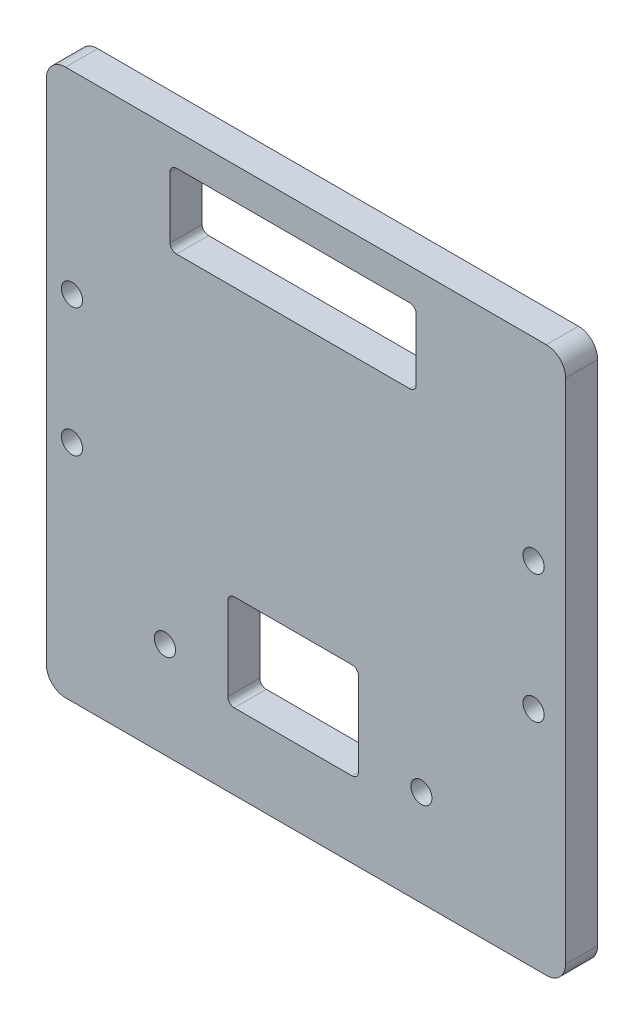
ISO-10303-21;
HEADER;
FILE_DESCRIPTION(('STEP AP214'),'2;1');
FILE_NAME('part.step','',(''),(''),'','','');
FILE_SCHEMA(('AUTOMOTIVE_DESIGN { 1 0 10303 214 1 1 1 1 }'));
ENDSEC;
DATA;
#1=APPLICATION_CONTEXT('core data for automotive mechanical design processes');
#2=APPLICATION_PROTOCOL_DEFINITION('international standard','automotive_design',2000,#1);
#3=PRODUCT_CONTEXT('',#1,'mechanical');
#4=PRODUCT('Part','Part','',(#3));
#5=PRODUCT_RELATED_PRODUCT_CATEGORY('part','',(#4));
#6=PRODUCT_DEFINITION_FORMATION('','',#4);
#7=PRODUCT_DEFINITION_CONTEXT('part definition',#1,'design');
#8=PRODUCT_DEFINITION('design','',#6,#7);
#9=PRODUCT_DEFINITION_SHAPE('','',#8);
#10=(LENGTH_UNIT() NAMED_UNIT(*) SI_UNIT(.MILLI.,.METRE.));
#11=(NAMED_UNIT(*) PLANE_ANGLE_UNIT() SI_UNIT($,.RADIAN.));
#12=(NAMED_UNIT(*) SI_UNIT($,.STERADIAN.) SOLID_ANGLE_UNIT());
#13=UNCERTAINTY_MEASURE_WITH_UNIT(LENGTH_MEASURE(1.E-05),#10,'distance_accuracy_value','');
#14=(GEOMETRIC_REPRESENTATION_CONTEXT(3) GLOBAL_UNCERTAINTY_ASSIGNED_CONTEXT((#13)) GLOBAL_UNIT_ASSIGNED_CONTEXT((#10,
#11,#12)) REPRESENTATION_CONTEXT('',''));
#15=CARTESIAN_POINT('',(0.,0.,0.));
#16=DIRECTION('',(0.,0.,1.));
#17=DIRECTION('',(1.,0.,0.));
#18=AXIS2_PLACEMENT_3D('',#15,#16,#17);
#19=CARTESIAN_POINT('',(0.,0.,43.4989056307904));
#20=DIRECTION('',(0.,0.,1.));
#21=DIRECTION('',(1.,0.,0.));
#22=AXIS2_PLACEMENT_3D('',#19,#20,#21);
#23=PLANE('',#22);
#24=CARTESIAN_POINT('',(16.7989221606857,40.7225688335815,43.4989056307904));
#25=DIRECTION('',(0.,0.,1.));
#26=DIRECTION('',(1.,0.,0.));
#27=AXIS2_PLACEMENT_3D('',#24,#25,#26);
#28=CIRCLE('',#27,1.65);
#29=CARTESIAN_POINT('',(18.4489221606857,40.7225688335815,43.4989056307904));
#30=VERTEX_POINT('',#29);
#31=EDGE_CURVE('E833',#30,#30,#28,.T.);
#32=ORIENTED_EDGE('',*,*,#31,.F.);
#33=EDGE_LOOP('',(#32));
#34=FACE_BOUND('',#33,.T.);
#35=CARTESIAN_POINT('',(-40.7010778393143,20.7225688335815,43.4989056307904));
#36=DIRECTION('',(0.,0.,1.));
#37=DIRECTION('',(1.,0.,0.));
#38=AXIS2_PLACEMENT_3D('',#35,#36,#37);
#39=CIRCLE('',#38,1.65);
#40=CARTESIAN_POINT('',(-39.0510778393143,20.7225688335815,43.4989056307904));
#41=VERTEX_POINT('',#40);
#42=EDGE_CURVE('E817',#41,#41,#39,.T.);
#43=ORIENTED_EDGE('',*,*,#42,.F.);
#44=EDGE_LOOP('',(#43));
#45=FACE_BOUND('',#44,.T.);
#46=CARTESIAN_POINT('',(-55.2010778393143,60.7225688335815,43.4989056307904));
#47=DIRECTION('',(0.,0.,1.));
#48=DIRECTION('',(1.,0.,0.));
#49=AXIS2_PLACEMENT_3D('',#46,#47,#48);
#50=CIRCLE('',#49,1.65);
#51=CARTESIAN_POINT('',(-53.5510778393143,60.7225688335815,43.4989056307904));
#52=VERTEX_POINT('',#51);
#53=EDGE_CURVE('E427',#52,#52,#50,.T.);
#54=ORIENTED_EDGE('',*,*,#53,.F.);
#55=EDGE_LOOP('',(#54));
#56=FACE_BOUND('',#55,.T.);
#57=DIRECTION('',(-1.,0.,0.));
#58=VECTOR('',#57,1.);
#59=CARTESIAN_POINT('',(-59.2010778393143,90.9225688335816,43.4989056307904));
#60=LINE('',#59,#58);
#61=CARTESIAN_POINT('',(18.7989221606857,90.9225688335816,43.4989056307904));
#62=VERTEX_POINT('',#61);
#63=CARTESIAN_POINT('',(-56.2010778393143,90.9225688335816,43.4989056307904));
#64=VERTEX_POINT('',#63);
#65=EDGE_CURVE('E245',#62,#64,#60,.T.);
#66=ORIENTED_EDGE('',*,*,#65,.T.);
#67=CARTESIAN_POINT('',(-56.2010778393143,87.9225688335816,43.4989056307904));
#68=DIRECTION('',(0.,0.,1.));
#69=DIRECTION('',(1.,0.,0.));
#70=AXIS2_PLACEMENT_3D('',#67,#68,#69);
#71=CIRCLE('',#70,3.);
#72=CARTESIAN_POINT('',(-59.2010778393143,87.9225688335816,43.4989056307904));
#73=VERTEX_POINT('',#72);
#74=EDGE_CURVE('E277',#64,#73,#71,.T.);
#75=ORIENTED_EDGE('',*,*,#74,.T.);
#76=DIRECTION('',(0.,-1.,0.));
#77=VECTOR('',#76,1.);
#78=CARTESIAN_POINT('',(-59.2010778393143,90.9225688335816,43.4989056307904));
#79=LINE('',#78,#77);
#80=CARTESIAN_POINT('',(-59.2010778393143,8.72256883358154,43.4989056307904));
#81=VERTEX_POINT('',#80);
#82=EDGE_CURVE('E224',#73,#81,#79,.T.);
#83=ORIENTED_EDGE('',*,*,#82,.T.);
#84=CARTESIAN_POINT('',(-56.2010778393143,8.72256883358153,43.4989056307904));
#85=DIRECTION('',(0.,0.,1.));
#86=DIRECTION('',(1.,0.,0.));
#87=AXIS2_PLACEMENT_3D('',#84,#85,#86);
#88=CIRCLE('',#87,3.);
#89=CARTESIAN_POINT('',(-56.2010778393143,5.72256883358153,43.4989056307904));
#90=VERTEX_POINT('',#89);
#91=EDGE_CURVE('E274',#81,#90,#88,.T.);
#92=ORIENTED_EDGE('',*,*,#91,.T.);
#93=DIRECTION('',(1.,0.,0.));
#94=VECTOR('',#93,1.);
#95=CARTESIAN_POINT('',(-59.2010778393143,5.72256883358153,43.4989056307904));
#96=LINE('',#95,#94);
#97=CARTESIAN_POINT('',(18.7989221606857,5.72256883358153,43.4989056307904));
#98=VERTEX_POINT('',#97);
#99=EDGE_CURVE('E461',#90,#98,#96,.T.);
#100=ORIENTED_EDGE('',*,*,#99,.T.);
#101=CARTESIAN_POINT('',(18.7989221606857,8.72256883358152,43.4989056307904));
#102=DIRECTION('',(0.,0.,1.));
#103=DIRECTION('',(1.,0.,0.));
#104=AXIS2_PLACEMENT_3D('',#101,#102,#103);
#105=CIRCLE('',#104,3.);
#106=CARTESIAN_POINT('',(21.7989221606857,8.72256883358152,43.4989056307904));
#107=VERTEX_POINT('',#106);
#108=EDGE_CURVE('E271',#98,#107,#105,.T.);
#109=ORIENTED_EDGE('',*,*,#108,.T.);
#110=DIRECTION('',(0.,1.,0.));
#111=VECTOR('',#110,1.);
#112=CARTESIAN_POINT('',(21.7989221606857,90.9225688335816,43.4989056307904));
#113=LINE('',#112,#111);
#114=CARTESIAN_POINT('',(21.7989221606857,87.9225688335816,43.4989056307904));
#115=VERTEX_POINT('',#114);
#116=EDGE_CURVE('E464',#107,#115,#113,.T.);
#117=ORIENTED_EDGE('',*,*,#116,.T.);
#118=CARTESIAN_POINT('',(18.7989221606857,87.9225688335816,43.4989056307904));
#119=DIRECTION('',(0.,0.,1.));
#120=DIRECTION('',(1.,0.,0.));
#121=AXIS2_PLACEMENT_3D('',#118,#119,#120);
#122=CIRCLE('',#121,3.);
#123=EDGE_CURVE('E268',#115,#62,#122,.T.);
#124=ORIENTED_EDGE('',*,*,#123,.T.);
#125=EDGE_LOOP('',(#66,#75,#83,#92,#100,#109,#117,#124));
#126=FACE_BOUND('',#125,.T.);
#127=DIRECTION('',(1.,0.,0.));
#128=VECTOR('',#127,1.);
#129=CARTESIAN_POINT('',(-30.9010778393143,17.5225688335815,43.4989056307904));
#130=LINE('',#129,#128);
#131=CARTESIAN_POINT('',(-29.9010778393143,17.5225688335815,43.4989056307904));
#132=VERTEX_POINT('',#131);
#133=CARTESIAN_POINT('',(-11.5010778393143,17.5225688335815,43.4989056307904));
#134=VERTEX_POINT('',#133);
#135=EDGE_CURVE('E437',#132,#134,#130,.T.);
#136=ORIENTED_EDGE('',*,*,#135,.F.);
#137=CARTESIAN_POINT('',(-29.9010778393143,18.5225688335815,43.4989056307904));
#138=DIRECTION('',(0.,0.,1.));
#139=DIRECTION('',(1.,0.,0.));
#140=AXIS2_PLACEMENT_3D('',#137,#138,#139);
#141=CIRCLE('',#140,1.);
#142=CARTESIAN_POINT('',(-30.9010778393143,18.5225688335815,43.4989056307904));
#143=VERTEX_POINT('',#142);
#144=EDGE_CURVE('E352',#132,#143,#141,.F.);
#145=ORIENTED_EDGE('',*,*,#144,.T.);
#146=DIRECTION('',(0.,-1.,0.));
#147=VECTOR('',#146,1.);
#148=CARTESIAN_POINT('',(-30.9010778393143,32.5225688335815,43.4989056307904));
#149=LINE('',#148,#147);
#150=CARTESIAN_POINT('',(-30.9010778393143,31.5225688335815,43.4989056307904));
#151=VERTEX_POINT('',#150);
#152=EDGE_CURVE('E433',#151,#143,#149,.T.);
#153=ORIENTED_EDGE('',*,*,#152,.F.);
#154=CARTESIAN_POINT('',(-29.9010778393143,31.5225688335815,43.4989056307904));
#155=DIRECTION('',(0.,0.,1.));
#156=DIRECTION('',(1.,0.,0.));
#157=AXIS2_PLACEMENT_3D('',#154,#155,#156);
#158=CIRCLE('',#157,1.);
#159=CARTESIAN_POINT('',(-29.9010778393143,32.5225688335815,43.4989056307904));
#160=VERTEX_POINT('',#159);
#161=EDGE_CURVE('E370',#151,#160,#158,.F.);
#162=ORIENTED_EDGE('',*,*,#161,.T.);
#163=DIRECTION('',(-1.,0.,0.));
#164=VECTOR('',#163,1.);
#165=CARTESIAN_POINT('',(-30.9010778393143,32.5225688335815,43.4989056307904));
#166=LINE('',#165,#164);
#167=CARTESIAN_POINT('',(-11.5010778393143,32.5225688335815,43.4989056307904));
#168=VERTEX_POINT('',#167);
#169=EDGE_CURVE('E234',#168,#160,#166,.T.);
#170=ORIENTED_EDGE('',*,*,#169,.F.);
#171=CARTESIAN_POINT('',(-11.5010778393143,31.5225688335815,43.4989056307904));
#172=DIRECTION('',(0.,0.,1.));
#173=DIRECTION('',(1.,0.,0.));
#174=AXIS2_PLACEMENT_3D('',#171,#172,#173);
#175=CIRCLE('',#174,1.);
#176=CARTESIAN_POINT('',(-10.5010778393143,31.5225688335815,43.4989056307904));
#177=VERTEX_POINT('',#176);
#178=EDGE_CURVE('E364',#168,#177,#175,.F.);
#179=ORIENTED_EDGE('',*,*,#178,.T.);
#180=DIRECTION('',(0.,1.,0.));
#181=VECTOR('',#180,1.);
#182=CARTESIAN_POINT('',(-10.5010778393143,32.5225688335815,43.4989056307904));
#183=LINE('',#182,#181);
#184=CARTESIAN_POINT('',(-10.5010778393143,18.5225688335815,43.4989056307904));
#185=VERTEX_POINT('',#184);
#186=EDGE_CURVE('E242',#185,#177,#183,.T.);
#187=ORIENTED_EDGE('',*,*,#186,.F.);
#188=CARTESIAN_POINT('',(-11.5010778393143,18.5225688335815,43.4989056307904));
#189=DIRECTION('',(0.,0.,1.));
#190=DIRECTION('',(1.,0.,0.));
#191=AXIS2_PLACEMENT_3D('',#188,#189,#190);
#192=CIRCLE('',#191,1.);
#193=EDGE_CURVE('E358',#185,#134,#192,.F.);
#194=ORIENTED_EDGE('',*,*,#193,.T.);
#195=EDGE_LOOP('',(#136,#145,#153,#162,#170,#179,#187,#194));
#196=FACE_BOUND('',#195,.T.);
#197=DIRECTION('',(1.,0.,0.));
#198=VECTOR('',#197,1.);
#199=CARTESIAN_POINT('',(-39.9010778393143,74.3225688335816,43.4989056307904));
#200=LINE('',#199,#198);
#201=CARTESIAN_POINT('',(-38.9010778393143,74.3225688335816,43.4989056307904));
#202=VERTEX_POINT('',#201);
#203=CARTESIAN_POINT('',(-2.5010778393143,74.3225688335816,43.4989056307904));
#204=VERTEX_POINT('',#203);
#205=EDGE_CURVE('E412',#202,#204,#200,.T.);
#206=ORIENTED_EDGE('',*,*,#205,.F.);
#207=CARTESIAN_POINT('',(-38.9010778393143,75.3225688335816,43.4989056307904));
#208=DIRECTION('',(0.,0.,1.));
#209=DIRECTION('',(1.,0.,0.));
#210=AXIS2_PLACEMENT_3D('',#207,#208,#209);
#211=CIRCLE('',#210,1.);
#212=CARTESIAN_POINT('',(-39.9010778393143,75.3225688335816,43.4989056307904));
#213=VERTEX_POINT('',#212);
#214=EDGE_CURVE('E382',#202,#213,#211,.F.);
#215=ORIENTED_EDGE('',*,*,#214,.T.);
#216=DIRECTION('',(0.,-1.,0.));
#217=VECTOR('',#216,1.);
#218=CARTESIAN_POINT('',(-39.9010778393143,85.9225688335816,43.4989056307904));
#219=LINE('',#218,#217);
#220=CARTESIAN_POINT('',(-39.9010778393143,84.9225688335816,43.4989056307904));
#221=VERTEX_POINT('',#220);
#222=EDGE_CURVE('E405',#221,#213,#219,.T.);
#223=ORIENTED_EDGE('',*,*,#222,.F.);
#224=CARTESIAN_POINT('',(-38.9010778393143,84.9225688335816,43.4989056307904));
#225=DIRECTION('',(0.,0.,1.));
#226=DIRECTION('',(1.,0.,0.));
#227=AXIS2_PLACEMENT_3D('',#224,#225,#226);
#228=CIRCLE('',#227,1.);
#229=CARTESIAN_POINT('',(-38.9010778393143,85.9225688335816,43.4989056307904));
#230=VERTEX_POINT('',#229);
#231=EDGE_CURVE('E376',#221,#230,#228,.F.);
#232=ORIENTED_EDGE('',*,*,#231,.T.);
#233=DIRECTION('',(-1.,0.,0.));
#234=VECTOR('',#233,1.);
#235=CARTESIAN_POINT('',(-39.9010778393143,85.9225688335816,43.4989056307904));
#236=LINE('',#235,#234);
#237=CARTESIAN_POINT('',(-2.50107783931431,85.9225688335816,43.4989056307904));
#238=VERTEX_POINT('',#237);
#239=EDGE_CURVE('E411',#238,#230,#236,.T.);
#240=ORIENTED_EDGE('',*,*,#239,.F.);
#241=CARTESIAN_POINT('',(-2.50107783931431,84.9225688335816,43.4989056307904));
#242=DIRECTION('',(0.,0.,1.));
#243=DIRECTION('',(1.,0.,0.));
#244=AXIS2_PLACEMENT_3D('',#241,#242,#243);
#245=CIRCLE('',#244,1.);
#246=CARTESIAN_POINT('',(-1.50107783931431,84.9225688335816,43.4989056307904));
#247=VERTEX_POINT('',#246);
#248=EDGE_CURVE('E11',#238,#247,#245,.F.);
#249=ORIENTED_EDGE('',*,*,#248,.T.);
#250=DIRECTION('',(0.,1.,0.));
#251=VECTOR('',#250,1.);
#252=CARTESIAN_POINT('',(-1.50107783931431,85.9225688335816,43.4989056307904));
#253=LINE('',#252,#251);
#254=CARTESIAN_POINT('',(-1.5010778393143,75.3225688335816,43.4989056307904));
#255=VERTEX_POINT('',#254);
#256=EDGE_CURVE('E408',#255,#247,#253,.T.);
#257=ORIENTED_EDGE('',*,*,#256,.F.);
#258=CARTESIAN_POINT('',(-2.5010778393143,75.3225688335816,43.4989056307904));
#259=DIRECTION('',(0.,0.,1.));
#260=DIRECTION('',(1.,0.,0.));
#261=AXIS2_PLACEMENT_3D('',#258,#259,#260);
#262=CIRCLE('',#261,1.);
#263=EDGE_CURVE('E388',#255,#204,#262,.F.);
#264=ORIENTED_EDGE('',*,*,#263,.T.);
#265=EDGE_LOOP('',(#206,#215,#223,#232,#240,#249,#257,#264));
#266=FACE_BOUND('',#265,.T.);
#267=CARTESIAN_POINT('',(-55.2010778393143,40.7225688335815,43.4989056307904));
#268=DIRECTION('',(0.,0.,1.));
#269=DIRECTION('',(1.,0.,0.));
#270=AXIS2_PLACEMENT_3D('',#267,#268,#269);
#271=CIRCLE('',#270,1.65);
#272=CARTESIAN_POINT('',(-53.5510778393143,40.7225688335815,43.4989056307904));
#273=VERTEX_POINT('',#272);
#274=EDGE_CURVE('E809',#273,#273,#271,.T.);
#275=ORIENTED_EDGE('',*,*,#274,.F.);
#276=EDGE_LOOP('',(#275));
#277=FACE_BOUND('',#276,.T.);
#278=CARTESIAN_POINT('',(-0.701077839314303,20.7225688335815,43.4989056307904));
#279=DIRECTION('',(0.,0.,1.));
#280=DIRECTION('',(1.,0.,0.));
#281=AXIS2_PLACEMENT_3D('',#278,#279,#280);
#282=CIRCLE('',#281,1.65);
#283=CARTESIAN_POINT('',(0.948922160685697,20.7225688335815,43.4989056307904));
#284=VERTEX_POINT('',#283);
#285=EDGE_CURVE('E825',#284,#284,#282,.T.);
#286=ORIENTED_EDGE('',*,*,#285,.F.);
#287=EDGE_LOOP('',(#286));
#288=FACE_BOUND('',#287,.T.);
#289=CARTESIAN_POINT('',(16.7989221606857,60.7225688335815,43.4989056307904));
#290=DIRECTION('',(0.,0.,1.));
#291=DIRECTION('',(1.,0.,0.));
#292=AXIS2_PLACEMENT_3D('',#289,#290,#291);
#293=CIRCLE('',#292,1.65);
#294=CARTESIAN_POINT('',(18.4489221606857,60.7225688335815,43.4989056307904));
#295=VERTEX_POINT('',#294);
#296=EDGE_CURVE('E841',#295,#295,#293,.T.);
#297=ORIENTED_EDGE('',*,*,#296,.F.);
#298=EDGE_LOOP('',(#297));
#299=FACE_BOUND('',#298,.T.);
#300=ADVANCED_FACE('F41',(#34,#45,#56,#126,#196,#266,#277,#288,#299),#23,.T.);
#301=CARTESIAN_POINT('',(0.,0.,38.4989056307904));
#302=DIRECTION('',(0.,0.,1.));
#303=DIRECTION('',(1.,0.,0.));
#304=AXIS2_PLACEMENT_3D('',#301,#302,#303);
#305=PLANE('',#304);
#306=DIRECTION('',(-1.,0.,0.));
#307=VECTOR('',#306,1.);
#308=CARTESIAN_POINT('',(-30.9010778393143,32.5225688335815,38.4989056307904));
#309=LINE('',#308,#307);
#310=CARTESIAN_POINT('',(-11.5010778393143,32.5225688335815,38.4989056307904));
#311=VERTEX_POINT('',#310);
#312=CARTESIAN_POINT('',(-29.9010778393143,32.5225688335815,38.4989056307904));
#313=VERTEX_POINT('',#312);
#314=EDGE_CURVE('E438',#311,#313,#309,.T.);
#315=ORIENTED_EDGE('',*,*,#314,.T.);
#316=CARTESIAN_POINT('',(-29.9010778393143,31.5225688335815,38.4989056307904));
#317=DIRECTION('',(0.,0.,1.));
#318=DIRECTION('',(1.,0.,0.));
#319=AXIS2_PLACEMENT_3D('',#316,#317,#318);
#320=CIRCLE('',#319,1.);
#321=CARTESIAN_POINT('',(-30.9010778393143,31.5225688335815,38.4989056307904));
#322=VERTEX_POINT('',#321);
#323=EDGE_CURVE('E367',#313,#322,#320,.T.);
#324=ORIENTED_EDGE('',*,*,#323,.T.);
#325=DIRECTION('',(0.,-1.,0.));
#326=VECTOR('',#325,1.);
#327=CARTESIAN_POINT('',(-30.9010778393143,32.5225688335815,38.4989056307904));
#328=LINE('',#327,#326);
#329=CARTESIAN_POINT('',(-30.9010778393143,18.5225688335815,38.4989056307904));
#330=VERTEX_POINT('',#329);
#331=EDGE_CURVE('E416',#322,#330,#328,.T.);
#332=ORIENTED_EDGE('',*,*,#331,.T.);
#333=CARTESIAN_POINT('',(-29.9010778393143,18.5225688335815,38.4989056307904));
#334=DIRECTION('',(0.,0.,1.));
#335=DIRECTION('',(1.,0.,0.));
#336=AXIS2_PLACEMENT_3D('',#333,#334,#335);
#337=CIRCLE('',#336,1.);
#338=CARTESIAN_POINT('',(-29.9010778393143,17.5225688335815,38.4989056307904));
#339=VERTEX_POINT('',#338);
#340=EDGE_CURVE('E349',#330,#339,#337,.T.);
#341=ORIENTED_EDGE('',*,*,#340,.T.);
#342=DIRECTION('',(1.,0.,0.));
#343=VECTOR('',#342,1.);
#344=CARTESIAN_POINT('',(-30.9010778393143,17.5225688335815,38.4989056307904));
#345=LINE('',#344,#343);
#346=CARTESIAN_POINT('',(-11.5010778393143,17.5225688335815,38.4989056307904));
#347=VERTEX_POINT('',#346);
#348=EDGE_CURVE('E448',#339,#347,#345,.T.);
#349=ORIENTED_EDGE('',*,*,#348,.T.);
#350=CARTESIAN_POINT('',(-11.5010778393143,18.5225688335815,38.4989056307904));
#351=DIRECTION('',(0.,0.,1.));
#352=DIRECTION('',(1.,0.,0.));
#353=AXIS2_PLACEMENT_3D('',#350,#351,#352);
#354=CIRCLE('',#353,1.);
#355=CARTESIAN_POINT('',(-10.5010778393143,18.5225688335815,38.4989056307904));
#356=VERTEX_POINT('',#355);
#357=EDGE_CURVE('E355',#347,#356,#354,.T.);
#358=ORIENTED_EDGE('',*,*,#357,.T.);
#359=DIRECTION('',(0.,1.,0.));
#360=VECTOR('',#359,1.);
#361=CARTESIAN_POINT('',(-10.5010778393143,32.5225688335815,38.4989056307904));
#362=LINE('',#361,#360);
#363=CARTESIAN_POINT('',(-10.5010778393143,31.5225688335815,38.4989056307904));
#364=VERTEX_POINT('',#363);
#365=EDGE_CURVE('E452',#356,#364,#362,.T.);
#366=ORIENTED_EDGE('',*,*,#365,.T.);
#367=CARTESIAN_POINT('',(-11.5010778393143,31.5225688335815,38.4989056307904));
#368=DIRECTION('',(0.,0.,1.));
#369=DIRECTION('',(1.,0.,0.));
#370=AXIS2_PLACEMENT_3D('',#367,#368,#369);
#371=CIRCLE('',#370,1.);
#372=EDGE_CURVE('E361',#364,#311,#371,.T.);
#373=ORIENTED_EDGE('',*,*,#372,.T.);
#374=EDGE_LOOP('',(#315,#324,#332,#341,#349,#358,#366,#373));
#375=FACE_BOUND('',#374,.T.);
#376=DIRECTION('',(0.,-1.,0.));
#377=VECTOR('',#376,1.);
#378=CARTESIAN_POINT('',(-59.2010778393143,90.9225688335816,38.4989056307904));
#379=LINE('',#378,#377);
#380=CARTESIAN_POINT('',(-59.2010778393143,87.9225688335816,38.4989056307904));
#381=VERTEX_POINT('',#380);
#382=CARTESIAN_POINT('',(-59.2010778393143,8.72256883358154,38.4989056307904));
#383=VERTEX_POINT('',#382);
#384=EDGE_CURVE('E221',#381,#383,#379,.T.);
#385=ORIENTED_EDGE('',*,*,#384,.F.);
#386=CARTESIAN_POINT('',(-56.2010778393143,87.9225688335816,38.4989056307904));
#387=DIRECTION('',(0.,0.,1.));
#388=DIRECTION('',(1.,0.,0.));
#389=AXIS2_PLACEMENT_3D('',#386,#387,#388);
#390=CIRCLE('',#389,3.);
#391=CARTESIAN_POINT('',(-56.2010778393143,90.9225688335816,38.4989056307904));
#392=VERTEX_POINT('',#391);
#393=EDGE_CURVE('E203',#381,#392,#390,.F.);
#394=ORIENTED_EDGE('',*,*,#393,.T.);
#395=DIRECTION('',(-1.,0.,0.));
#396=VECTOR('',#395,1.);
#397=CARTESIAN_POINT('',(-59.2010778393143,90.9225688335816,38.4989056307904));
#398=LINE('',#397,#396);
#399=CARTESIAN_POINT('',(18.7989221606857,90.9225688335816,38.4989056307904));
#400=VERTEX_POINT('',#399);
#401=EDGE_CURVE('E251',#400,#392,#398,.T.);
#402=ORIENTED_EDGE('',*,*,#401,.F.);
#403=CARTESIAN_POINT('',(18.7989221606857,87.9225688335816,38.4989056307904));
#404=DIRECTION('',(0.,0.,1.));
#405=DIRECTION('',(1.,0.,0.));
#406=AXIS2_PLACEMENT_3D('',#403,#404,#405);
#407=CIRCLE('',#406,3.);
#408=CARTESIAN_POINT('',(21.7989221606857,87.9225688335816,38.4989056307904));
#409=VERTEX_POINT('',#408);
#410=EDGE_CURVE('E226',#400,#409,#407,.F.);
#411=ORIENTED_EDGE('',*,*,#410,.T.);
#412=DIRECTION('',(0.,1.,0.));
#413=VECTOR('',#412,1.);
#414=CARTESIAN_POINT('',(21.7989221606857,90.9225688335816,38.4989056307904));
#415=LINE('',#414,#413);
#416=CARTESIAN_POINT('',(21.7989221606857,8.72256883358152,38.4989056307904));
#417=VERTEX_POINT('',#416);
#418=EDGE_CURVE('E239',#417,#409,#415,.T.);
#419=ORIENTED_EDGE('',*,*,#418,.F.);
#420=CARTESIAN_POINT('',(18.7989221606857,8.72256883358152,38.4989056307904));
#421=DIRECTION('',(0.,0.,1.));
#422=DIRECTION('',(1.,0.,0.));
#423=AXIS2_PLACEMENT_3D('',#420,#421,#422);
#424=CIRCLE('',#423,3.);
#425=CARTESIAN_POINT('',(18.7989221606857,5.72256883358153,38.4989056307904));
#426=VERTEX_POINT('',#425);
#427=EDGE_CURVE('E258',#417,#426,#424,.F.);
#428=ORIENTED_EDGE('',*,*,#427,.T.);
#429=DIRECTION('',(1.,0.,0.));
#430=VECTOR('',#429,1.);
#431=CARTESIAN_POINT('',(-59.2010778393143,5.72256883358153,38.4989056307904));
#432=LINE('',#431,#430);
#433=CARTESIAN_POINT('',(-56.2010778393143,5.72256883358153,38.4989056307904));
#434=VERTEX_POINT('',#433);
#435=EDGE_CURVE('E233',#434,#426,#432,.T.);
#436=ORIENTED_EDGE('',*,*,#435,.F.);
#437=CARTESIAN_POINT('',(-56.2010778393143,8.72256883358153,38.4989056307904));
#438=DIRECTION('',(0.,0.,1.));
#439=DIRECTION('',(1.,0.,0.));
#440=AXIS2_PLACEMENT_3D('',#437,#438,#439);
#441=CIRCLE('',#440,3.);
#442=EDGE_CURVE('E215',#434,#383,#441,.F.);
#443=ORIENTED_EDGE('',*,*,#442,.T.);
#444=EDGE_LOOP('',(#385,#394,#402,#411,#419,#428,#436,#443));
#445=FACE_BOUND('',#444,.T.);
#446=DIRECTION('',(-1.,0.,0.));
#447=VECTOR('',#446,1.);
#448=CARTESIAN_POINT('',(-39.9010778393143,85.9225688335816,38.4989056307904));
#449=LINE('',#448,#447);
#450=CARTESIAN_POINT('',(-2.50107783931431,85.9225688335816,38.4989056307904));
#451=VERTEX_POINT('',#450);
#452=CARTESIAN_POINT('',(-38.9010778393143,85.9225688335816,38.4989056307904));
#453=VERTEX_POINT('',#452);
#454=EDGE_CURVE('E395',#451,#453,#449,.T.);
#455=ORIENTED_EDGE('',*,*,#454,.T.);
#456=CARTESIAN_POINT('',(-38.9010778393143,84.9225688335816,38.4989056307904));
#457=DIRECTION('',(0.,0.,1.));
#458=DIRECTION('',(1.,0.,0.));
#459=AXIS2_PLACEMENT_3D('',#456,#457,#458);
#460=CIRCLE('',#459,1.);
#461=CARTESIAN_POINT('',(-39.9010778393143,84.9225688335816,38.4989056307904));
#462=VERTEX_POINT('',#461);
#463=EDGE_CURVE('E373',#453,#462,#460,.T.);
#464=ORIENTED_EDGE('',*,*,#463,.T.);
#465=DIRECTION('',(0.,-1.,0.));
#466=VECTOR('',#465,1.);
#467=CARTESIAN_POINT('',(-39.9010778393143,85.9225688335816,38.4989056307904));
#468=LINE('',#467,#466);
#469=CARTESIAN_POINT('',(-39.9010778393143,75.3225688335816,38.4989056307904));
#470=VERTEX_POINT('',#469);
#471=EDGE_CURVE('E422',#462,#470,#468,.T.);
#472=ORIENTED_EDGE('',*,*,#471,.T.);
#473=CARTESIAN_POINT('',(-38.9010778393143,75.3225688335816,38.4989056307904));
#474=DIRECTION('',(0.,0.,1.));
#475=DIRECTION('',(1.,0.,0.));
#476=AXIS2_PLACEMENT_3D('',#473,#474,#475);
#477=CIRCLE('',#476,1.);
#478=CARTESIAN_POINT('',(-38.9010778393143,74.3225688335816,38.4989056307904));
#479=VERTEX_POINT('',#478);
#480=EDGE_CURVE('E379',#470,#479,#477,.T.);
#481=ORIENTED_EDGE('',*,*,#480,.T.);
#482=DIRECTION('',(1.,0.,0.));
#483=VECTOR('',#482,1.);
#484=CARTESIAN_POINT('',(-39.9010778393143,74.3225688335816,38.4989056307904));
#485=LINE('',#484,#483);
#486=CARTESIAN_POINT('',(-2.5010778393143,74.3225688335816,38.4989056307904));
#487=VERTEX_POINT('',#486);
#488=EDGE_CURVE('E426',#479,#487,#485,.T.);
#489=ORIENTED_EDGE('',*,*,#488,.T.);
#490=CARTESIAN_POINT('',(-2.5010778393143,75.3225688335816,38.4989056307904));
#491=DIRECTION('',(0.,0.,1.));
#492=DIRECTION('',(1.,0.,0.));
#493=AXIS2_PLACEMENT_3D('',#490,#491,#492);
#494=CIRCLE('',#493,1.);
#495=CARTESIAN_POINT('',(-1.5010778393143,75.3225688335816,38.4989056307904));
#496=VERTEX_POINT('',#495);
#497=EDGE_CURVE('E385',#487,#496,#494,.T.);
#498=ORIENTED_EDGE('',*,*,#497,.T.);
#499=DIRECTION('',(0.,1.,0.));
#500=VECTOR('',#499,1.);
#501=CARTESIAN_POINT('',(-1.50107783931431,85.9225688335816,38.4989056307904));
#502=LINE('',#501,#500);
#503=CARTESIAN_POINT('',(-1.50107783931431,84.9225688335816,38.4989056307904));
#504=VERTEX_POINT('',#503);
#505=EDGE_CURVE('E396',#496,#504,#502,.T.);
#506=ORIENTED_EDGE('',*,*,#505,.T.);
#507=CARTESIAN_POINT('',(-2.50107783931431,84.9225688335816,38.4989056307904));
#508=DIRECTION('',(0.,0.,1.));
#509=DIRECTION('',(1.,0.,0.));
#510=AXIS2_PLACEMENT_3D('',#507,#508,#509);
#511=CIRCLE('',#510,1.);
#512=EDGE_CURVE('E50',#504,#451,#511,.T.);
#513=ORIENTED_EDGE('',*,*,#512,.T.);
#514=EDGE_LOOP('',(#455,#464,#472,#481,#489,#498,#506,#513));
#515=FACE_BOUND('',#514,.T.);
#516=CARTESIAN_POINT('',(-55.2010778393143,60.7225688335815,38.4989056307904));
#517=DIRECTION('',(0.,0.,1.));
#518=DIRECTION('',(1.,0.,0.));
#519=AXIS2_PLACEMENT_3D('',#516,#517,#518);
#520=CIRCLE('',#519,1.65);
#521=CARTESIAN_POINT('',(-53.5510778393143,60.7225688335815,38.4989056307904));
#522=VERTEX_POINT('',#521);
#523=EDGE_CURVE('E805',#522,#522,#520,.T.);
#524=ORIENTED_EDGE('',*,*,#523,.T.);
#525=EDGE_LOOP('',(#524));
#526=FACE_BOUND('',#525,.T.);
#527=CARTESIAN_POINT('',(-55.2010778393143,40.7225688335815,38.4989056307904));
#528=DIRECTION('',(0.,0.,1.));
#529=DIRECTION('',(1.,0.,0.));
#530=AXIS2_PLACEMENT_3D('',#527,#528,#529);
#531=CIRCLE('',#530,1.65);
#532=CARTESIAN_POINT('',(-53.5510778393143,40.7225688335815,38.4989056307904));
#533=VERTEX_POINT('',#532);
#534=EDGE_CURVE('E813',#533,#533,#531,.T.);
#535=ORIENTED_EDGE('',*,*,#534,.T.);
#536=EDGE_LOOP('',(#535));
#537=FACE_BOUND('',#536,.T.);
#538=CARTESIAN_POINT('',(-40.7010778393143,20.7225688335815,38.4989056307904));
#539=DIRECTION('',(0.,0.,1.));
#540=DIRECTION('',(1.,0.,0.));
#541=AXIS2_PLACEMENT_3D('',#538,#539,#540);
#542=CIRCLE('',#541,1.65);
#543=CARTESIAN_POINT('',(-39.0510778393143,20.7225688335815,38.4989056307904));
#544=VERTEX_POINT('',#543);
#545=EDGE_CURVE('E821',#544,#544,#542,.T.);
#546=ORIENTED_EDGE('',*,*,#545,.T.);
#547=EDGE_LOOP('',(#546));
#548=FACE_BOUND('',#547,.T.);
#549=CARTESIAN_POINT('',(-0.701077839314303,20.7225688335815,38.4989056307904));
#550=DIRECTION('',(0.,0.,1.));
#551=DIRECTION('',(1.,0.,0.));
#552=AXIS2_PLACEMENT_3D('',#549,#550,#551);
#553=CIRCLE('',#552,1.65);
#554=CARTESIAN_POINT('',(0.948922160685697,20.7225688335815,38.4989056307904));
#555=VERTEX_POINT('',#554);
#556=EDGE_CURVE('E829',#555,#555,#553,.T.);
#557=ORIENTED_EDGE('',*,*,#556,.T.);
#558=EDGE_LOOP('',(#557));
#559=FACE_BOUND('',#558,.T.);
#560=CARTESIAN_POINT('',(16.7989221606857,40.7225688335815,38.4989056307904));
#561=DIRECTION('',(0.,0.,1.));
#562=DIRECTION('',(1.,0.,0.));
#563=AXIS2_PLACEMENT_3D('',#560,#561,#562);
#564=CIRCLE('',#563,1.65);
#565=CARTESIAN_POINT('',(18.4489221606857,40.7225688335815,38.4989056307904));
#566=VERTEX_POINT('',#565);
#567=EDGE_CURVE('E837',#566,#566,#564,.T.);
#568=ORIENTED_EDGE('',*,*,#567,.T.);
#569=EDGE_LOOP('',(#568));
#570=FACE_BOUND('',#569,.T.);
#571=CARTESIAN_POINT('',(16.7989221606857,60.7225688335815,38.4989056307904));
#572=DIRECTION('',(0.,0.,1.));
#573=DIRECTION('',(1.,0.,0.));
#574=AXIS2_PLACEMENT_3D('',#571,#572,#573);
#575=CIRCLE('',#574,1.65);
#576=CARTESIAN_POINT('',(18.4489221606857,60.7225688335815,38.4989056307904));
#577=VERTEX_POINT('',#576);
#578=EDGE_CURVE('E845',#577,#577,#575,.T.);
#579=ORIENTED_EDGE('',*,*,#578,.T.);
#580=EDGE_LOOP('',(#579));
#581=FACE_BOUND('',#580,.T.);
#582=ADVANCED_FACE('F229',(#375,#445,#515,#526,#537,#548,#559,#570,#581),#305,.F.);
#583=CARTESIAN_POINT('',(-59.2010778393143,90.9225688335816,43.4989056307904));
#584=DIRECTION('',(1.,0.,0.));
#585=DIRECTION('',(0.,1.,0.));
#586=AXIS2_PLACEMENT_3D('',#583,#584,#585);
#587=PLANE('',#586);
#588=ORIENTED_EDGE('',*,*,#82,.F.);
#589=DIRECTION('',(0.,0.,-1.));
#590=VECTOR('',#589,1.);
#591=CARTESIAN_POINT('',(-59.2010778393143,87.9225688335816,43.4989056307904));
#592=LINE('',#591,#590);
#593=EDGE_CURVE('E207',#73,#381,#592,.T.);
#594=ORIENTED_EDGE('',*,*,#593,.T.);
#595=ORIENTED_EDGE('',*,*,#384,.T.);
#596=DIRECTION('',(0.,0.,-1.));
#597=VECTOR('',#596,1.);
#598=CARTESIAN_POINT('',(-59.2010778393143,8.72256883358154,43.4989056307904));
#599=LINE('',#598,#597);
#600=EDGE_CURVE('E227',#383,#81,#599,.F.);
#601=ORIENTED_EDGE('',*,*,#600,.T.);
#602=EDGE_LOOP('',(#588,#594,#595,#601));
#603=FACE_BOUND('',#602,.T.);
#604=ADVANCED_FACE('F220',(#603),#587,.F.);
#605=CARTESIAN_POINT('',(-59.2010778393143,5.72256883358153,43.4989056307904));
#606=DIRECTION('',(0.,1.,0.));
#607=DIRECTION('',(-1.,0.,0.));
#608=AXIS2_PLACEMENT_3D('',#605,#606,#607);
#609=PLANE('',#608);
#610=ORIENTED_EDGE('',*,*,#99,.F.);
#611=DIRECTION('',(0.,0.,-1.));
#612=VECTOR('',#611,1.);
#613=CARTESIAN_POINT('',(-56.2010778393143,5.72256883358153,43.4989056307904));
#614=LINE('',#613,#612);
#615=EDGE_CURVE('E283',#90,#434,#614,.T.);
#616=ORIENTED_EDGE('',*,*,#615,.T.);
#617=ORIENTED_EDGE('',*,*,#435,.T.);
#618=DIRECTION('',(0.,0.,-1.));
#619=VECTOR('',#618,1.);
#620=CARTESIAN_POINT('',(18.7989221606857,5.72256883358153,43.4989056307904));
#621=LINE('',#620,#619);
#622=EDGE_CURVE('E280',#426,#98,#621,.F.);
#623=ORIENTED_EDGE('',*,*,#622,.T.);
#624=EDGE_LOOP('',(#610,#616,#617,#623));
#625=FACE_BOUND('',#624,.T.);
#626=ADVANCED_FACE('F490',(#625),#609,.F.);
#627=CARTESIAN_POINT('',(21.7989221606857,90.9225688335816,43.4989056307904));
#628=DIRECTION('',(-1.,0.,0.));
#629=DIRECTION('',(0.,-1.,0.));
#630=AXIS2_PLACEMENT_3D('',#627,#628,#629);
#631=PLANE('',#630);
#632=ORIENTED_EDGE('',*,*,#116,.F.);
#633=DIRECTION('',(0.,0.,-1.));
#634=VECTOR('',#633,1.);
#635=CARTESIAN_POINT('',(21.7989221606857,8.72256883358152,43.4989056307904));
#636=LINE('',#635,#634);
#637=EDGE_CURVE('E290',#107,#417,#636,.T.);
#638=ORIENTED_EDGE('',*,*,#637,.T.);
#639=ORIENTED_EDGE('',*,*,#418,.T.);
#640=DIRECTION('',(0.,0.,-1.));
#641=VECTOR('',#640,1.);
#642=CARTESIAN_POINT('',(21.7989221606857,87.9225688335816,43.4989056307904));
#643=LINE('',#642,#641);
#644=EDGE_CURVE('E287',#409,#115,#643,.F.);
#645=ORIENTED_EDGE('',*,*,#644,.T.);
#646=EDGE_LOOP('',(#632,#638,#639,#645));
#647=FACE_BOUND('',#646,.T.);
#648=ADVANCED_FACE('F482',(#647),#631,.F.);
#649=CARTESIAN_POINT('',(-59.2010778393143,90.9225688335816,43.4989056307904));
#650=DIRECTION('',(0.,-1.,0.));
#651=DIRECTION('',(1.,0.,0.));
#652=AXIS2_PLACEMENT_3D('',#649,#650,#651);
#653=PLANE('',#652);
#654=ORIENTED_EDGE('',*,*,#401,.T.);
#655=DIRECTION('',(0.,0.,-1.));
#656=VECTOR('',#655,1.);
#657=CARTESIAN_POINT('',(-56.2010778393143,90.9225688335816,43.4989056307904));
#658=LINE('',#657,#656);
#659=EDGE_CURVE('E208',#392,#64,#658,.F.);
#660=ORIENTED_EDGE('',*,*,#659,.T.);
#661=ORIENTED_EDGE('',*,*,#65,.F.);
#662=DIRECTION('',(0.,0.,-1.));
#663=VECTOR('',#662,1.);
#664=CARTESIAN_POINT('',(18.7989221606857,90.9225688335816,43.4989056307904));
#665=LINE('',#664,#663);
#666=EDGE_CURVE('E214',#62,#400,#665,.T.);
#667=ORIENTED_EDGE('',*,*,#666,.T.);
#668=EDGE_LOOP('',(#654,#660,#661,#667));
#669=FACE_BOUND('',#668,.T.);
#670=ADVANCED_FACE('F476',(#669),#653,.F.);
#671=CARTESIAN_POINT('',(-30.9010778393143,32.5225688335815,43.4989056307904));
#672=DIRECTION('',(1.,0.,0.));
#673=DIRECTION('',(0.,1.,0.));
#674=AXIS2_PLACEMENT_3D('',#671,#672,#673);
#675=PLANE('',#674);
#676=ORIENTED_EDGE('',*,*,#152,.T.);
#677=DIRECTION('',(0.,0.,-1.));
#678=VECTOR('',#677,1.);
#679=CARTESIAN_POINT('',(-30.9010778393143,18.5225688335815,38.4989056307904));
#680=LINE('',#679,#678);
#681=EDGE_CURVE('E297',#143,#330,#680,.T.);
#682=ORIENTED_EDGE('',*,*,#681,.T.);
#683=ORIENTED_EDGE('',*,*,#331,.F.);
#684=DIRECTION('',(0.,0.,-1.));
#685=VECTOR('',#684,1.);
#686=CARTESIAN_POINT('',(-30.9010778393143,31.5225688335815,43.4989056307904));
#687=LINE('',#686,#685);
#688=EDGE_CURVE('E294',#322,#151,#687,.F.);
#689=ORIENTED_EDGE('',*,*,#688,.T.);
#690=EDGE_LOOP('',(#676,#682,#683,#689));
#691=FACE_BOUND('',#690,.T.);
#692=ADVANCED_FACE('F515',(#691),#675,.T.);
#693=CARTESIAN_POINT('',(-30.9010778393143,17.5225688335815,43.4989056307904));
#694=DIRECTION('',(0.,1.,0.));
#695=DIRECTION('',(0.,0.,1.));
#696=AXIS2_PLACEMENT_3D('',#693,#694,#695);
#697=PLANE('',#696);
#698=ORIENTED_EDGE('',*,*,#348,.F.);
#699=DIRECTION('',(0.,0.,-1.));
#700=VECTOR('',#699,1.);
#701=CARTESIAN_POINT('',(-29.9010778393143,17.5225688335815,43.4989056307904));
#702=LINE('',#701,#700);
#703=EDGE_CURVE('E305',#339,#132,#702,.F.);
#704=ORIENTED_EDGE('',*,*,#703,.T.);
#705=ORIENTED_EDGE('',*,*,#135,.T.);
#706=DIRECTION('',(0.,0.,-1.));
#707=VECTOR('',#706,1.);
#708=CARTESIAN_POINT('',(-11.5010778393143,17.5225688335815,38.4989056307904));
#709=LINE('',#708,#707);
#710=EDGE_CURVE('E301',#134,#347,#709,.T.);
#711=ORIENTED_EDGE('',*,*,#710,.T.);
#712=EDGE_LOOP('',(#698,#704,#705,#711));
#713=FACE_BOUND('',#712,.T.);
#714=ADVANCED_FACE('F549',(#713),#697,.T.);
#715=CARTESIAN_POINT('',(-10.5010778393143,32.5225688335815,43.4989056307904));
#716=DIRECTION('',(-1.,0.,0.));
#717=DIRECTION('',(0.,0.,1.));
#718=AXIS2_PLACEMENT_3D('',#715,#716,#717);
#719=PLANE('',#718);
#720=ORIENTED_EDGE('',*,*,#365,.F.);
#721=DIRECTION('',(0.,0.,-1.));
#722=VECTOR('',#721,1.);
#723=CARTESIAN_POINT('',(-10.5010778393143,18.5225688335815,43.4989056307904));
#724=LINE('',#723,#722);
#725=EDGE_CURVE('E312',#356,#185,#724,.F.);
#726=ORIENTED_EDGE('',*,*,#725,.T.);
#727=ORIENTED_EDGE('',*,*,#186,.T.);
#728=DIRECTION('',(0.,0.,-1.));
#729=VECTOR('',#728,1.);
#730=CARTESIAN_POINT('',(-10.5010778393143,31.5225688335815,38.4989056307904));
#731=LINE('',#730,#729);
#732=EDGE_CURVE('E308',#177,#364,#731,.T.);
#733=ORIENTED_EDGE('',*,*,#732,.T.);
#734=EDGE_LOOP('',(#720,#726,#727,#733));
#735=FACE_BOUND('',#734,.T.);
#736=ADVANCED_FACE('F556',(#735),#719,.T.);
#737=CARTESIAN_POINT('',(-30.9010778393143,32.5225688335815,43.4989056307904));
#738=DIRECTION('',(0.,-1.,0.));
#739=DIRECTION('',(0.,0.,-1.));
#740=AXIS2_PLACEMENT_3D('',#737,#738,#739);
#741=PLANE('',#740);
#742=ORIENTED_EDGE('',*,*,#314,.F.);
#743=DIRECTION('',(0.,0.,-1.));
#744=VECTOR('',#743,1.);
#745=CARTESIAN_POINT('',(-11.5010778393143,32.5225688335815,43.4989056307904));
#746=LINE('',#745,#744);
#747=EDGE_CURVE('E319',#311,#168,#746,.F.);
#748=ORIENTED_EDGE('',*,*,#747,.T.);
#749=ORIENTED_EDGE('',*,*,#169,.T.);
#750=DIRECTION('',(0.,0.,-1.));
#751=VECTOR('',#750,1.);
#752=CARTESIAN_POINT('',(-29.9010778393143,32.5225688335815,38.4989056307904));
#753=LINE('',#752,#751);
#754=EDGE_CURVE('E315',#160,#313,#753,.T.);
#755=ORIENTED_EDGE('',*,*,#754,.T.);
#756=EDGE_LOOP('',(#742,#748,#749,#755));
#757=FACE_BOUND('',#756,.T.);
#758=ADVANCED_FACE('F563',(#757),#741,.T.);
#759=CARTESIAN_POINT('',(-39.9010778393143,85.9225688335816,43.4989056307904));
#760=DIRECTION('',(1.,0.,0.));
#761=DIRECTION('',(0.,0.,-1.));
#762=AXIS2_PLACEMENT_3D('',#759,#760,#761);
#763=PLANE('',#762);
#764=ORIENTED_EDGE('',*,*,#471,.F.);
#765=DIRECTION('',(0.,0.,-1.));
#766=VECTOR('',#765,1.);
#767=CARTESIAN_POINT('',(-39.9010778393143,84.9225688335816,43.4989056307904));
#768=LINE('',#767,#766);
#769=EDGE_CURVE('E333',#462,#221,#768,.F.);
#770=ORIENTED_EDGE('',*,*,#769,.T.);
#771=ORIENTED_EDGE('',*,*,#222,.T.);
#772=DIRECTION('',(0.,0.,-1.));
#773=VECTOR('',#772,1.);
#774=CARTESIAN_POINT('',(-39.9010778393143,75.3225688335816,38.4989056307904));
#775=LINE('',#774,#773);
#776=EDGE_CURVE('E329',#213,#470,#775,.T.);
#777=ORIENTED_EDGE('',*,*,#776,.T.);
#778=EDGE_LOOP('',(#764,#770,#771,#777));
#779=FACE_BOUND('',#778,.T.);
#780=ADVANCED_FACE('F571',(#779),#763,.T.);
#781=CARTESIAN_POINT('',(-39.9010778393143,74.3225688335816,43.4989056307904));
#782=DIRECTION('',(0.,1.,0.));
#783=DIRECTION('',(-1.,0.,0.));
#784=AXIS2_PLACEMENT_3D('',#781,#782,#783);
#785=PLANE('',#784);
#786=ORIENTED_EDGE('',*,*,#488,.F.);
#787=DIRECTION('',(0.,0.,-1.));
#788=VECTOR('',#787,1.);
#789=CARTESIAN_POINT('',(-38.9010778393143,74.3225688335816,43.4989056307904));
#790=LINE('',#789,#788);
#791=EDGE_CURVE('E340',#479,#202,#790,.F.);
#792=ORIENTED_EDGE('',*,*,#791,.T.);
#793=ORIENTED_EDGE('',*,*,#205,.T.);
#794=DIRECTION('',(0.,0.,-1.));
#795=VECTOR('',#794,1.);
#796=CARTESIAN_POINT('',(-2.5010778393143,74.3225688335816,38.4989056307904));
#797=LINE('',#796,#795);
#798=EDGE_CURVE('E336',#204,#487,#797,.T.);
#799=ORIENTED_EDGE('',*,*,#798,.T.);
#800=EDGE_LOOP('',(#786,#792,#793,#799));
#801=FACE_BOUND('',#800,.T.);
#802=ADVANCED_FACE('F579',(#801),#785,.T.);
#803=CARTESIAN_POINT('',(-1.50107783931431,85.9225688335816,43.4989056307904));
#804=DIRECTION('',(-1.,0.,0.));
#805=DIRECTION('',(0.,-1.,0.));
#806=AXIS2_PLACEMENT_3D('',#803,#804,#805);
#807=PLANE('',#806);
#808=ORIENTED_EDGE('',*,*,#505,.F.);
#809=DIRECTION('',(0.,0.,-1.));
#810=VECTOR('',#809,1.);
#811=CARTESIAN_POINT('',(-1.5010778393143,75.3225688335816,43.4989056307904));
#812=LINE('',#811,#810);
#813=EDGE_CURVE('E62',#496,#255,#812,.F.);
#814=ORIENTED_EDGE('',*,*,#813,.T.);
#815=ORIENTED_EDGE('',*,*,#256,.T.);
#816=DIRECTION('',(0.,0.,-1.));
#817=VECTOR('',#816,1.);
#818=CARTESIAN_POINT('',(-1.50107783931431,84.9225688335816,38.4989056307904));
#819=LINE('',#818,#817);
#820=EDGE_CURVE('E343',#247,#504,#819,.T.);
#821=ORIENTED_EDGE('',*,*,#820,.T.);
#822=EDGE_LOOP('',(#808,#814,#815,#821));
#823=FACE_BOUND('',#822,.T.);
#824=ADVANCED_FACE('F407',(#823),#807,.T.);
#825=CARTESIAN_POINT('',(-39.9010778393143,85.9225688335816,43.4989056307904));
#826=DIRECTION('',(0.,-1.,0.));
#827=DIRECTION('',(1.,0.,0.));
#828=AXIS2_PLACEMENT_3D('',#825,#826,#827);
#829=PLANE('',#828);
#830=ORIENTED_EDGE('',*,*,#239,.T.);
#831=DIRECTION('',(0.,0.,-1.));
#832=VECTOR('',#831,1.);
#833=CARTESIAN_POINT('',(-38.9010778393143,85.9225688335816,38.4989056307904));
#834=LINE('',#833,#832);
#835=EDGE_CURVE('E325',#230,#453,#834,.T.);
#836=ORIENTED_EDGE('',*,*,#835,.T.);
#837=ORIENTED_EDGE('',*,*,#454,.F.);
#838=DIRECTION('',(0.,0.,-1.));
#839=VECTOR('',#838,1.);
#840=CARTESIAN_POINT('',(-2.50107783931431,85.9225688335816,43.4989056307904));
#841=LINE('',#840,#839);
#842=EDGE_CURVE('E322',#451,#238,#841,.F.);
#843=ORIENTED_EDGE('',*,*,#842,.T.);
#844=EDGE_LOOP('',(#830,#836,#837,#843));
#845=FACE_BOUND('',#844,.T.);
#846=ADVANCED_FACE('F402',(#845),#829,.T.);
#847=CARTESIAN_POINT('',(-55.2010778393143,60.7225688335815,43.4989056307904));
#848=DIRECTION('',(0.,0.,-1.));
#849=DIRECTION('',(-1.,0.,0.));
#850=AXIS2_PLACEMENT_3D('',#847,#848,#849);
#851=CYLINDRICAL_SURFACE('',#850,1.65);
#852=ORIENTED_EDGE('',*,*,#53,.T.);
#853=EDGE_LOOP('',(#852));
#854=FACE_BOUND('',#853,.T.);
#855=ORIENTED_EDGE('',*,*,#523,.F.);
#856=EDGE_LOOP('',(#855));
#857=FACE_BOUND('',#856,.T.);
#858=ADVANCED_FACE('F600',(#854,#857),#851,.F.);
#859=CARTESIAN_POINT('',(-55.2010778393143,40.7225688335815,43.4989056307904));
#860=DIRECTION('',(0.,0.,-1.));
#861=DIRECTION('',(-1.,0.,0.));
#862=AXIS2_PLACEMENT_3D('',#859,#860,#861);
#863=CYLINDRICAL_SURFACE('',#862,1.65);
#864=ORIENTED_EDGE('',*,*,#274,.T.);
#865=EDGE_LOOP('',(#864));
#866=FACE_BOUND('',#865,.T.);
#867=ORIENTED_EDGE('',*,*,#534,.F.);
#868=EDGE_LOOP('',(#867));
#869=FACE_BOUND('',#868,.T.);
#870=ADVANCED_FACE('F608',(#866,#869),#863,.F.);
#871=CARTESIAN_POINT('',(-40.7010778393143,20.7225688335815,43.4989056307904));
#872=DIRECTION('',(0.,0.,-1.));
#873=DIRECTION('',(-1.,0.,0.));
#874=AXIS2_PLACEMENT_3D('',#871,#872,#873);
#875=CYLINDRICAL_SURFACE('',#874,1.65);
#876=ORIENTED_EDGE('',*,*,#42,.T.);
#877=EDGE_LOOP('',(#876));
#878=FACE_BOUND('',#877,.T.);
#879=ORIENTED_EDGE('',*,*,#545,.F.);
#880=EDGE_LOOP('',(#879));
#881=FACE_BOUND('',#880,.T.);
#882=ADVANCED_FACE('F616',(#878,#881),#875,.F.);
#883=CARTESIAN_POINT('',(-0.701077839314303,20.7225688335815,43.4989056307904));
#884=DIRECTION('',(0.,0.,-1.));
#885=DIRECTION('',(-1.,0.,0.));
#886=AXIS2_PLACEMENT_3D('',#883,#884,#885);
#887=CYLINDRICAL_SURFACE('',#886,1.65);
#888=ORIENTED_EDGE('',*,*,#285,.T.);
#889=EDGE_LOOP('',(#888));
#890=FACE_BOUND('',#889,.T.);
#891=ORIENTED_EDGE('',*,*,#556,.F.);
#892=EDGE_LOOP('',(#891));
#893=FACE_BOUND('',#892,.T.);
#894=ADVANCED_FACE('F624',(#890,#893),#887,.F.);
#895=CARTESIAN_POINT('',(16.7989221606857,40.7225688335815,43.4989056307904));
#896=DIRECTION('',(0.,0.,-1.));
#897=DIRECTION('',(-1.,0.,0.));
#898=AXIS2_PLACEMENT_3D('',#895,#896,#897);
#899=CYLINDRICAL_SURFACE('',#898,1.65);
#900=ORIENTED_EDGE('',*,*,#31,.T.);
#901=EDGE_LOOP('',(#900));
#902=FACE_BOUND('',#901,.T.);
#903=ORIENTED_EDGE('',*,*,#567,.F.);
#904=EDGE_LOOP('',(#903));
#905=FACE_BOUND('',#904,.T.);
#906=ADVANCED_FACE('F632',(#902,#905),#899,.F.);
#907=CARTESIAN_POINT('',(16.7989221606857,60.7225688335815,43.4989056307904));
#908=DIRECTION('',(0.,0.,-1.));
#909=DIRECTION('',(-1.,0.,0.));
#910=AXIS2_PLACEMENT_3D('',#907,#908,#909);
#911=CYLINDRICAL_SURFACE('',#910,1.65);
#912=ORIENTED_EDGE('',*,*,#296,.T.);
#913=EDGE_LOOP('',(#912));
#914=FACE_BOUND('',#913,.T.);
#915=ORIENTED_EDGE('',*,*,#578,.F.);
#916=EDGE_LOOP('',(#915));
#917=FACE_BOUND('',#916,.T.);
#918=ADVANCED_FACE('F502',(#914,#917),#911,.F.);
#919=CARTESIAN_POINT('',(-56.2010778393143,87.9225688335816,43.4989056307904));
#920=DIRECTION('',(0.,0.,-1.));
#921=DIRECTION('',(-1.,0.,0.));
#922=AXIS2_PLACEMENT_3D('',#919,#920,#921);
#923=CYLINDRICAL_SURFACE('',#922,3.);
#924=ORIENTED_EDGE('',*,*,#74,.F.);
#925=ORIENTED_EDGE('',*,*,#659,.F.);
#926=ORIENTED_EDGE('',*,*,#393,.F.);
#927=ORIENTED_EDGE('',*,*,#593,.F.);
#928=EDGE_LOOP('',(#924,#925,#926,#927));
#929=FACE_BOUND('',#928,.T.);
#930=ADVANCED_FACE('F206',(#929),#923,.T.);
#931=CARTESIAN_POINT('',(-56.2010778393143,8.72256883358153,43.4989056307904));
#932=DIRECTION('',(0.,0.,-1.));
#933=DIRECTION('',(-1.,0.,0.));
#934=AXIS2_PLACEMENT_3D('',#931,#932,#933);
#935=CYLINDRICAL_SURFACE('',#934,3.);
#936=ORIENTED_EDGE('',*,*,#91,.F.);
#937=ORIENTED_EDGE('',*,*,#600,.F.);
#938=ORIENTED_EDGE('',*,*,#442,.F.);
#939=ORIENTED_EDGE('',*,*,#615,.F.);
#940=EDGE_LOOP('',(#936,#937,#938,#939));
#941=FACE_BOUND('',#940,.T.);
#942=ADVANCED_FACE('F494',(#941),#935,.T.);
#943=CARTESIAN_POINT('',(18.7989221606857,8.72256883358152,43.4989056307904));
#944=DIRECTION('',(0.,0.,-1.));
#945=DIRECTION('',(-1.,0.,0.));
#946=AXIS2_PLACEMENT_3D('',#943,#944,#945);
#947=CYLINDRICAL_SURFACE('',#946,3.);
#948=ORIENTED_EDGE('',*,*,#108,.F.);
#949=ORIENTED_EDGE('',*,*,#622,.F.);
#950=ORIENTED_EDGE('',*,*,#427,.F.);
#951=ORIENTED_EDGE('',*,*,#637,.F.);
#952=EDGE_LOOP('',(#948,#949,#950,#951));
#953=FACE_BOUND('',#952,.T.);
#954=ADVANCED_FACE('F486',(#953),#947,.T.);
#955=CARTESIAN_POINT('',(18.7989221606857,87.9225688335816,43.4989056307904));
#956=DIRECTION('',(0.,0.,-1.));
#957=DIRECTION('',(-1.,0.,0.));
#958=AXIS2_PLACEMENT_3D('',#955,#956,#957);
#959=CYLINDRICAL_SURFACE('',#958,3.);
#960=ORIENTED_EDGE('',*,*,#123,.F.);
#961=ORIENTED_EDGE('',*,*,#644,.F.);
#962=ORIENTED_EDGE('',*,*,#410,.F.);
#963=ORIENTED_EDGE('',*,*,#666,.F.);
#964=EDGE_LOOP('',(#960,#961,#962,#963));
#965=FACE_BOUND('',#964,.T.);
#966=ADVANCED_FACE('F478',(#965),#959,.T.);
#967=CARTESIAN_POINT('',(-29.9010778393143,18.5225688335815,43.4989056307904));
#968=DIRECTION('',(0.,0.,1.));
#969=DIRECTION('',(1.,0.,0.));
#970=AXIS2_PLACEMENT_3D('',#967,#968,#969);
#971=CYLINDRICAL_SURFACE('',#970,1.);
#972=ORIENTED_EDGE('',*,*,#144,.F.);
#973=ORIENTED_EDGE('',*,*,#703,.F.);
#974=ORIENTED_EDGE('',*,*,#340,.F.);
#975=ORIENTED_EDGE('',*,*,#681,.F.);
#976=EDGE_LOOP('',(#972,#973,#974,#975));
#977=FACE_BOUND('',#976,.T.);
#978=ADVANCED_FACE('F668',(#977),#971,.F.);
#979=CARTESIAN_POINT('',(-11.5010778393143,18.5225688335815,43.4989056307904));
#980=DIRECTION('',(0.,0.,1.));
#981=DIRECTION('',(1.,0.,0.));
#982=AXIS2_PLACEMENT_3D('',#979,#980,#981);
#983=CYLINDRICAL_SURFACE('',#982,1.);
#984=ORIENTED_EDGE('',*,*,#193,.F.);
#985=ORIENTED_EDGE('',*,*,#725,.F.);
#986=ORIENTED_EDGE('',*,*,#357,.F.);
#987=ORIENTED_EDGE('',*,*,#710,.F.);
#988=EDGE_LOOP('',(#984,#985,#986,#987));
#989=FACE_BOUND('',#988,.T.);
#990=ADVANCED_FACE('F721',(#989),#983,.F.);
#991=CARTESIAN_POINT('',(-11.5010778393143,31.5225688335815,43.4989056307904));
#992=DIRECTION('',(0.,0.,1.));
#993=DIRECTION('',(1.,0.,0.));
#994=AXIS2_PLACEMENT_3D('',#991,#992,#993);
#995=CYLINDRICAL_SURFACE('',#994,1.);
#996=ORIENTED_EDGE('',*,*,#178,.F.);
#997=ORIENTED_EDGE('',*,*,#747,.F.);
#998=ORIENTED_EDGE('',*,*,#372,.F.);
#999=ORIENTED_EDGE('',*,*,#732,.F.);
#1000=EDGE_LOOP('',(#996,#997,#998,#999));
#1001=FACE_BOUND('',#1000,.T.);
#1002=ADVANCED_FACE('F728',(#1001),#995,.F.);
#1003=CARTESIAN_POINT('',(-29.9010778393143,31.5225688335815,43.4989056307904));
#1004=DIRECTION('',(0.,0.,1.));
#1005=DIRECTION('',(1.,0.,0.));
#1006=AXIS2_PLACEMENT_3D('',#1003,#1004,#1005);
#1007=CYLINDRICAL_SURFACE('',#1006,1.);
#1008=ORIENTED_EDGE('',*,*,#161,.F.);
#1009=ORIENTED_EDGE('',*,*,#688,.F.);
#1010=ORIENTED_EDGE('',*,*,#323,.F.);
#1011=ORIENTED_EDGE('',*,*,#754,.F.);
#1012=EDGE_LOOP('',(#1008,#1009,#1010,#1011));
#1013=FACE_BOUND('',#1012,.T.);
#1014=ADVANCED_FACE('F736',(#1013),#1007,.F.);
#1015=CARTESIAN_POINT('',(-38.9010778393143,84.9225688335816,43.4989056307904));
#1016=DIRECTION('',(0.,0.,1.));
#1017=DIRECTION('',(1.,0.,0.));
#1018=AXIS2_PLACEMENT_3D('',#1015,#1016,#1017);
#1019=CYLINDRICAL_SURFACE('',#1018,1.);
#1020=ORIENTED_EDGE('',*,*,#231,.F.);
#1021=ORIENTED_EDGE('',*,*,#769,.F.);
#1022=ORIENTED_EDGE('',*,*,#463,.F.);
#1023=ORIENTED_EDGE('',*,*,#835,.F.);
#1024=EDGE_LOOP('',(#1020,#1021,#1022,#1023));
#1025=FACE_BOUND('',#1024,.T.);
#1026=ADVANCED_FACE('F744',(#1025),#1019,.F.);
#1027=CARTESIAN_POINT('',(-38.9010778393143,75.3225688335816,43.4989056307904));
#1028=DIRECTION('',(0.,0.,1.));
#1029=DIRECTION('',(1.,0.,0.));
#1030=AXIS2_PLACEMENT_3D('',#1027,#1028,#1029);
#1031=CYLINDRICAL_SURFACE('',#1030,1.);
#1032=ORIENTED_EDGE('',*,*,#214,.F.);
#1033=ORIENTED_EDGE('',*,*,#791,.F.);
#1034=ORIENTED_EDGE('',*,*,#480,.F.);
#1035=ORIENTED_EDGE('',*,*,#776,.F.);
#1036=EDGE_LOOP('',(#1032,#1033,#1034,#1035));
#1037=FACE_BOUND('',#1036,.T.);
#1038=ADVANCED_FACE('F752',(#1037),#1031,.F.);
#1039=CARTESIAN_POINT('',(-2.5010778393143,75.3225688335816,43.4989056307904));
#1040=DIRECTION('',(0.,0.,1.));
#1041=DIRECTION('',(1.,0.,0.));
#1042=AXIS2_PLACEMENT_3D('',#1039,#1040,#1041);
#1043=CYLINDRICAL_SURFACE('',#1042,1.);
#1044=ORIENTED_EDGE('',*,*,#263,.F.);
#1045=ORIENTED_EDGE('',*,*,#813,.F.);
#1046=ORIENTED_EDGE('',*,*,#497,.F.);
#1047=ORIENTED_EDGE('',*,*,#798,.F.);
#1048=EDGE_LOOP('',(#1044,#1045,#1046,#1047));
#1049=FACE_BOUND('',#1048,.T.);
#1050=ADVANCED_FACE('F760',(#1049),#1043,.F.);
#1051=CARTESIAN_POINT('',(-2.50107783931431,84.9225688335816,43.4989056307904));
#1052=DIRECTION('',(0.,0.,1.));
#1053=DIRECTION('',(1.,0.,0.));
#1054=AXIS2_PLACEMENT_3D('',#1051,#1052,#1053);
#1055=CYLINDRICAL_SURFACE('',#1054,1.);
#1056=ORIENTED_EDGE('',*,*,#248,.F.);
#1057=ORIENTED_EDGE('',*,*,#842,.F.);
#1058=ORIENTED_EDGE('',*,*,#512,.F.);
#1059=ORIENTED_EDGE('',*,*,#820,.F.);
#1060=EDGE_LOOP('',(#1056,#1057,#1058,#1059));
#1061=FACE_BOUND('',#1060,.T.);
#1062=ADVANCED_FACE('F43',(#1061),#1055,.F.);
#1063=CLOSED_SHELL('',(#300,#582,#604,#626,#648,#670,#692,#714,#736,#758,#780,#802,#824,#846,
#858,#870,#882,#894,#906,#918,#930,#942,#954,#966,#978,#990,#1002,#1014,#1026,#1038,#1050,#1062));
#1064=MANIFOLD_SOLID_BREP('B2',#1063);
#1065=ADVANCED_BREP_SHAPE_REPRESENTATION('',(#18,#1064),#14);
#1066=SHAPE_DEFINITION_REPRESENTATION(#9,#1065);
ENDSEC;
END-ISO-10303-21;
